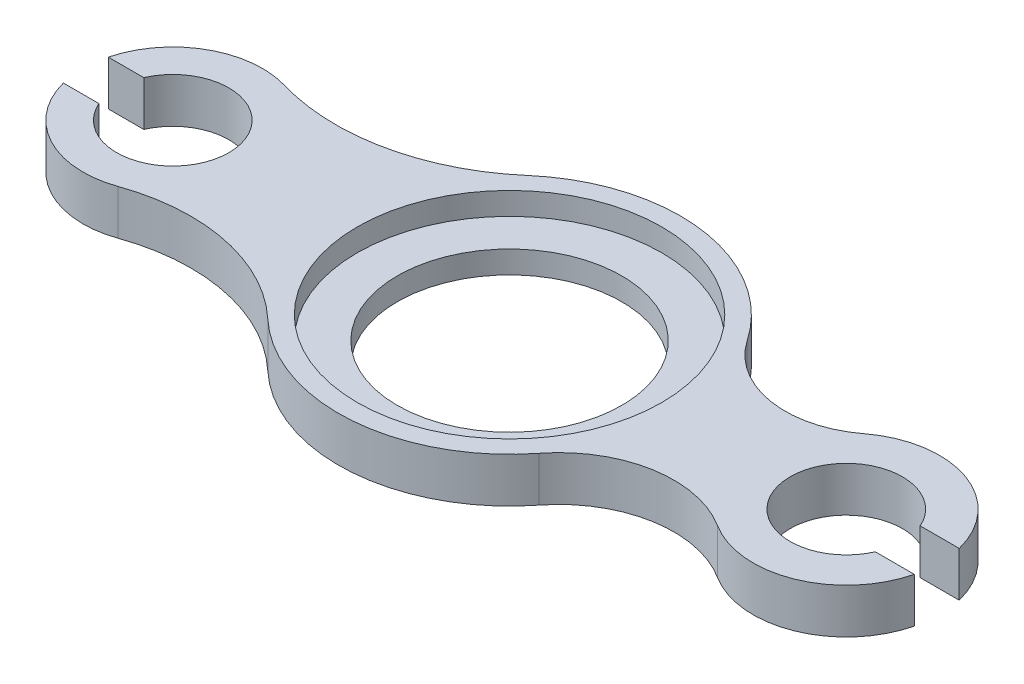
ISO-10303-21;
HEADER;
FILE_DESCRIPTION(('STEP AP214'),'2;1');
FILE_NAME('part.step','',(''),(''),'','','');
FILE_SCHEMA(('AUTOMOTIVE_DESIGN { 1 0 10303 214 1 1 1 1 }'));
ENDSEC;
DATA;
#1=APPLICATION_CONTEXT('core data for automotive mechanical design processes');
#2=APPLICATION_PROTOCOL_DEFINITION('international standard','automotive_design',2000,#1);
#3=PRODUCT_CONTEXT('',#1,'mechanical');
#4=PRODUCT('Part','Part','',(#3));
#5=PRODUCT_RELATED_PRODUCT_CATEGORY('part','',(#4));
#6=PRODUCT_DEFINITION_FORMATION('','',#4);
#7=PRODUCT_DEFINITION_CONTEXT('part definition',#1,'design');
#8=PRODUCT_DEFINITION('design','',#6,#7);
#9=PRODUCT_DEFINITION_SHAPE('','',#8);
#10=(LENGTH_UNIT() NAMED_UNIT(*) SI_UNIT(.MILLI.,.METRE.));
#11=(NAMED_UNIT(*) PLANE_ANGLE_UNIT() SI_UNIT($,.RADIAN.));
#12=(NAMED_UNIT(*) SI_UNIT($,.STERADIAN.) SOLID_ANGLE_UNIT());
#13=UNCERTAINTY_MEASURE_WITH_UNIT(LENGTH_MEASURE(1.E-05),#10,'distance_accuracy_value','');
#14=(GEOMETRIC_REPRESENTATION_CONTEXT(3) GLOBAL_UNCERTAINTY_ASSIGNED_CONTEXT((#13)) GLOBAL_UNIT_ASSIGNED_CONTEXT((#10,
#11,#12)) REPRESENTATION_CONTEXT('',''));
#15=CARTESIAN_POINT('',(0.,0.,0.));
#16=DIRECTION('',(0.,0.,1.));
#17=DIRECTION('',(1.,0.,0.));
#18=AXIS2_PLACEMENT_3D('',#15,#16,#17);
#19=CARTESIAN_POINT('',(0.,20.,-10.));
#20=DIRECTION('',(0.,0.,-1.));
#21=DIRECTION('',(-1.,0.,0.));
#22=AXIS2_PLACEMENT_3D('',#19,#20,#21);
#23=PLANE('',#22);
#24=DIRECTION('',(1.,0.,0.));
#25=VECTOR('',#24,1.);
#26=CARTESIAN_POINT('',(0.,0.,-10.));
#27=LINE('',#26,#25);
#28=CARTESIAN_POINT('',(242.754590009258,0.,-10.));
#29=VERTEX_POINT('',#28);
#30=CARTESIAN_POINT('',(260.147485469304,0.,-10.));
#31=VERTEX_POINT('',#30);
#32=EDGE_CURVE('E192',#29,#31,#27,.T.);
#33=ORIENTED_EDGE('',*,*,#32,.T.);
#34=DIRECTION('',(0.,-1.,0.));
#35=VECTOR('',#34,1.);
#36=CARTESIAN_POINT('',(260.147485469304,20.,-10.));
#37=LINE('',#36,#35);
#38=CARTESIAN_POINT('',(260.147485469304,20.,-10.));
#39=VERTEX_POINT('',#38);
#40=EDGE_CURVE('E51',#39,#31,#37,.T.);
#41=ORIENTED_EDGE('',*,*,#40,.F.);
#42=DIRECTION('',(1.,0.,0.));
#43=VECTOR('',#42,1.);
#44=CARTESIAN_POINT('',(0.,20.,-10.));
#45=LINE('',#44,#43);
#46=CARTESIAN_POINT('',(242.754590009258,20.,-10.));
#47=VERTEX_POINT('',#46);
#48=EDGE_CURVE('E414',#47,#39,#45,.T.);
#49=ORIENTED_EDGE('',*,*,#48,.F.);
#50=DIRECTION('',(0.,-1.,0.));
#51=VECTOR('',#50,1.);
#52=CARTESIAN_POINT('',(242.754590009258,20.,-10.));
#53=LINE('',#52,#51);
#54=EDGE_CURVE('E59',#47,#29,#53,.T.);
#55=ORIENTED_EDGE('',*,*,#54,.T.);
#56=EDGE_LOOP('',(#33,#41,#49,#55));
#57=FACE_BOUND('',#56,.T.);
#58=ADVANCED_FACE('F41',(#57),#23,.F.);
#59=CARTESIAN_POINT('',(219.841711534479,20.,0.));
#60=DIRECTION('',(0.,-1.,0.));
#61=DIRECTION('',(0.,0.,-1.));
#62=AXIS2_PLACEMENT_3D('',#59,#60,#61);
#63=CYLINDRICAL_SURFACE('',#62,41.5277667649636);
#64=CARTESIAN_POINT('',(219.841711534479,0.,0.));
#65=DIRECTION('',(0.,1.,0.));
#66=DIRECTION('',(0.,0.,1.));
#67=AXIS2_PLACEMENT_3D('',#64,#65,#66);
#68=CIRCLE('',#67,41.5277667649636);
#69=CARTESIAN_POINT('',(194.644031061955,0.,-33.0095790838023));
#70=VERTEX_POINT('',#69);
#71=EDGE_CURVE('E195',#31,#70,#68,.T.);
#72=ORIENTED_EDGE('',*,*,#71,.T.);
#73=DIRECTION('',(0.,-1.,0.));
#74=VECTOR('',#73,1.);
#75=CARTESIAN_POINT('',(194.644031061955,20.,-33.0095790838023));
#76=LINE('',#75,#74);
#77=CARTESIAN_POINT('',(194.644031061955,20.,-33.0095790838023));
#78=VERTEX_POINT('',#77);
#79=EDGE_CURVE('E290',#78,#70,#76,.T.);
#80=ORIENTED_EDGE('',*,*,#79,.F.);
#81=CARTESIAN_POINT('',(219.841711534479,20.,0.));
#82=DIRECTION('',(0.,1.,0.));
#83=DIRECTION('',(0.,0.,1.));
#84=AXIS2_PLACEMENT_3D('',#81,#82,#83);
#85=CIRCLE('',#84,41.5277667649636);
#86=EDGE_CURVE('E122',#39,#78,#85,.T.);
#87=ORIENTED_EDGE('',*,*,#86,.F.);
#88=ORIENTED_EDGE('',*,*,#40,.T.);
#89=EDGE_LOOP('',(#72,#80,#87,#88));
#90=FACE_BOUND('',#89,.T.);
#91=ADVANCED_FACE('F294',(#90),#63,.T.);
#92=CARTESIAN_POINT('',(168.418508371809,20.,-67.3656566679429));
#93=DIRECTION('',(0.,-1.,0.));
#94=DIRECTION('',(0.,0.,-1.));
#95=AXIS2_PLACEMENT_3D('',#92,#93,#94);
#96=CYLINDRICAL_SURFACE('',#95,43.2217318873138);
#97=CARTESIAN_POINT('',(168.418508371809,0.,-67.3656566679429));
#98=DIRECTION('',(0.,1.,0.));
#99=DIRECTION('',(0.,0.,1.));
#100=AXIS2_PLACEMENT_3D('',#97,#98,#99);
#101=CIRCLE('',#100,43.2217318873138);
#102=CARTESIAN_POINT('',(132.733534148836,0.,-42.9791702042355));
#103=VERTEX_POINT('',#102);
#104=EDGE_CURVE('E200',#103,#70,#101,.T.);
#105=ORIENTED_EDGE('',*,*,#104,.F.);
#106=DIRECTION('',(0.,-1.,0.));
#107=VECTOR('',#106,1.);
#108=CARTESIAN_POINT('',(132.733534148836,20.,-42.9791702042355));
#109=LINE('',#108,#107);
#110=CARTESIAN_POINT('',(132.733534148836,20.,-42.9791702042355));
#111=VERTEX_POINT('',#110);
#112=EDGE_CURVE('E287',#111,#103,#109,.T.);
#113=ORIENTED_EDGE('',*,*,#112,.F.);
#114=CARTESIAN_POINT('',(168.418508371809,20.,-67.3656566679429));
#115=DIRECTION('',(0.,1.,0.));
#116=DIRECTION('',(0.,0.,1.));
#117=AXIS2_PLACEMENT_3D('',#114,#115,#116);
#118=CIRCLE('',#117,43.2217318873138);
#119=EDGE_CURVE('E424',#111,#78,#118,.T.);
#120=ORIENTED_EDGE('',*,*,#119,.T.);
#121=ORIENTED_EDGE('',*,*,#79,.T.);
#122=EDGE_LOOP('',(#105,#113,#120,#121));
#123=FACE_BOUND('',#122,.T.);
#124=ADVANCED_FACE('F314',(#123),#96,.F.);
#125=CARTESIAN_POINT('',(69.8417115344792,20.,0.));
#126=DIRECTION('',(0.,-1.,0.));
#127=DIRECTION('',(0.,0.,-1.));
#128=AXIS2_PLACEMENT_3D('',#125,#126,#127);
#129=CYLINDRICAL_SURFACE('',#128,76.1747361216329);
#130=CARTESIAN_POINT('',(69.8417115344792,0.,0.));
#131=DIRECTION('',(0.,1.,0.));
#132=DIRECTION('',(0.,0.,1.));
#133=AXIS2_PLACEMENT_3D('',#130,#131,#132);
#134=CIRCLE('',#133,76.1747361216329);
#135=CARTESIAN_POINT('',(20.1305181494598,0.,-57.7181745677877));
#136=VERTEX_POINT('',#135);
#137=EDGE_CURVE('E204',#103,#136,#134,.T.);
#138=ORIENTED_EDGE('',*,*,#137,.T.);
#139=DIRECTION('',(0.,-1.,0.));
#140=VECTOR('',#139,1.);
#141=CARTESIAN_POINT('',(20.1305181494598,20.,-57.7181745677877));
#142=LINE('',#141,#140);
#143=CARTESIAN_POINT('',(20.1305181494598,20.,-57.7181745677877));
#144=VERTEX_POINT('',#143);
#145=EDGE_CURVE('E284',#144,#136,#142,.T.);
#146=ORIENTED_EDGE('',*,*,#145,.F.);
#147=CARTESIAN_POINT('',(69.8417115344792,20.,0.));
#148=DIRECTION('',(0.,1.,0.));
#149=DIRECTION('',(0.,0.,1.));
#150=AXIS2_PLACEMENT_3D('',#147,#148,#149);
#151=CIRCLE('',#150,76.1747361216329);
#152=EDGE_CURVE('E428',#111,#144,#151,.T.);
#153=ORIENTED_EDGE('',*,*,#152,.F.);
#154=ORIENTED_EDGE('',*,*,#112,.T.);
#155=EDGE_LOOP('',(#138,#146,#153,#154));
#156=FACE_BOUND('',#155,.T.);
#157=ADVANCED_FACE('F319',(#156),#129,.T.);
#158=CARTESIAN_POINT('',(-42.201654217441,20.,-130.09018901527));
#159=DIRECTION('',(0.,-1.,0.));
#160=DIRECTION('',(0.,0.,-1.));
#161=AXIS2_PLACEMENT_3D('',#158,#159,#160);
#162=CYLINDRICAL_SURFACE('',#161,95.5144396788446);
#163=CARTESIAN_POINT('',(-42.201654217441,0.,-130.09018901527));
#164=DIRECTION('',(0.,1.,0.));
#165=DIRECTION('',(0.,0.,1.));
#166=AXIS2_PLACEMENT_3D('',#163,#164,#165);
#167=CIRCLE('',#166,95.5144396788446);
#168=CARTESIAN_POINT('',(-68.9545719204698,0.,-38.398915812535));
#169=VERTEX_POINT('',#168);
#170=EDGE_CURVE('E208',#169,#136,#167,.T.);
#171=ORIENTED_EDGE('',*,*,#170,.F.);
#172=DIRECTION('',(0.,-1.,0.));
#173=VECTOR('',#172,1.);
#174=CARTESIAN_POINT('',(-68.9545719204698,20.,-38.398915812535));
#175=LINE('',#174,#173);
#176=CARTESIAN_POINT('',(-68.9545719204698,20.,-38.398915812535));
#177=VERTEX_POINT('',#176);
#178=EDGE_CURVE('E281',#177,#169,#175,.T.);
#179=ORIENTED_EDGE('',*,*,#178,.F.);
#180=CARTESIAN_POINT('',(-42.201654217441,20.,-130.09018901527));
#181=DIRECTION('',(0.,1.,0.));
#182=DIRECTION('',(0.,0.,1.));
#183=AXIS2_PLACEMENT_3D('',#180,#181,#182);
#184=CIRCLE('',#183,95.5144396788446);
#185=EDGE_CURVE('E431',#177,#144,#184,.T.);
#186=ORIENTED_EDGE('',*,*,#185,.T.);
#187=ORIENTED_EDGE('',*,*,#145,.T.);
#188=EDGE_LOOP('',(#171,#179,#186,#187));
#189=FACE_BOUND('',#188,.T.);
#190=ADVANCED_FACE('F323',(#189),#162,.F.);
#191=CARTESIAN_POINT('',(-80.1582884655208,20.,0.));
#192=DIRECTION('',(0.,-1.,0.));
#193=DIRECTION('',(0.,0.,-1.));
#194=AXIS2_PLACEMENT_3D('',#191,#192,#193);
#195=CYLINDRICAL_SURFACE('',#194,40.);
#196=CARTESIAN_POINT('',(-80.1582884655208,0.,0.));
#197=DIRECTION('',(0.,1.,0.));
#198=DIRECTION('',(0.,0.,1.));
#199=AXIS2_PLACEMENT_3D('',#196,#197,#198);
#200=CIRCLE('',#199,40.);
#201=CARTESIAN_POINT('',(-118.888121927595,0.,-10.));
#202=VERTEX_POINT('',#201);
#203=EDGE_CURVE('E212',#169,#202,#200,.T.);
#204=ORIENTED_EDGE('',*,*,#203,.T.);
#205=DIRECTION('',(0.,-1.,0.));
#206=VECTOR('',#205,1.);
#207=CARTESIAN_POINT('',(-118.888121927595,20.,-10.));
#208=LINE('',#207,#206);
#209=CARTESIAN_POINT('',(-118.888121927595,20.,-10.));
#210=VERTEX_POINT('',#209);
#211=EDGE_CURVE('E277',#210,#202,#208,.T.);
#212=ORIENTED_EDGE('',*,*,#211,.F.);
#213=CARTESIAN_POINT('',(-80.1582884655208,20.,0.));
#214=DIRECTION('',(0.,1.,0.));
#215=DIRECTION('',(0.,0.,1.));
#216=AXIS2_PLACEMENT_3D('',#213,#214,#215);
#217=CIRCLE('',#216,40.);
#218=EDGE_CURVE('E435',#177,#210,#217,.T.);
#219=ORIENTED_EDGE('',*,*,#218,.F.);
#220=ORIENTED_EDGE('',*,*,#178,.T.);
#221=EDGE_LOOP('',(#204,#212,#219,#220));
#222=FACE_BOUND('',#221,.T.);
#223=ADVANCED_FACE('F327',(#222),#195,.T.);
#224=CARTESIAN_POINT('',(0.,20.,-10.));
#225=DIRECTION('',(0.,0.,-1.));
#226=DIRECTION('',(-1.,0.,0.));
#227=AXIS2_PLACEMENT_3D('',#224,#225,#226);
#228=PLANE('',#227);
#229=DIRECTION('',(1.,0.,0.));
#230=VECTOR('',#229,1.);
#231=CARTESIAN_POINT('',(0.,0.,-10.));
#232=LINE('',#231,#230);
#233=CARTESIAN_POINT('',(-103.0711669403,0.,-10.));
#234=VERTEX_POINT('',#233);
#235=EDGE_CURVE('E215',#202,#234,#232,.T.);
#236=ORIENTED_EDGE('',*,*,#235,.T.);
#237=DIRECTION('',(0.,-1.,0.));
#238=VECTOR('',#237,1.);
#239=CARTESIAN_POINT('',(-103.0711669403,20.,-10.));
#240=LINE('',#239,#238);
#241=CARTESIAN_POINT('',(-103.0711669403,20.,-10.));
#242=VERTEX_POINT('',#241);
#243=EDGE_CURVE('E274',#242,#234,#240,.T.);
#244=ORIENTED_EDGE('',*,*,#243,.F.);
#245=DIRECTION('',(1.,0.,0.));
#246=VECTOR('',#245,1.);
#247=CARTESIAN_POINT('',(0.,20.,-10.));
#248=LINE('',#247,#246);
#249=EDGE_CURVE('E438',#210,#242,#248,.T.);
#250=ORIENTED_EDGE('',*,*,#249,.F.);
#251=ORIENTED_EDGE('',*,*,#211,.T.);
#252=EDGE_LOOP('',(#236,#244,#250,#251));
#253=FACE_BOUND('',#252,.T.);
#254=ADVANCED_FACE('F331',(#253),#228,.F.);
#255=CARTESIAN_POINT('',(-80.1582884655208,20.,0.));
#256=DIRECTION('',(0.,-1.,0.));
#257=DIRECTION('',(0.,0.,-1.));
#258=AXIS2_PLACEMENT_3D('',#255,#256,#257);
#259=CYLINDRICAL_SURFACE('',#258,25.);
#260=CARTESIAN_POINT('',(-80.1582884655208,0.,0.));
#261=DIRECTION('',(0.,1.,0.));
#262=DIRECTION('',(0.,0.,1.));
#263=AXIS2_PLACEMENT_3D('',#260,#261,#262);
#264=CIRCLE('',#263,25.);
#265=CARTESIAN_POINT('',(-103.0711669403,0.,10.));
#266=VERTEX_POINT('',#265);
#267=EDGE_CURVE('E219',#266,#234,#264,.T.);
#268=ORIENTED_EDGE('',*,*,#267,.F.);
#269=DIRECTION('',(0.,-1.,0.));
#270=VECTOR('',#269,1.);
#271=CARTESIAN_POINT('',(-103.0711669403,20.,10.));
#272=LINE('',#271,#270);
#273=CARTESIAN_POINT('',(-103.0711669403,20.,10.));
#274=VERTEX_POINT('',#273);
#275=EDGE_CURVE('E271',#274,#266,#272,.T.);
#276=ORIENTED_EDGE('',*,*,#275,.F.);
#277=CARTESIAN_POINT('',(-80.1582884655208,20.,0.));
#278=DIRECTION('',(0.,1.,0.));
#279=DIRECTION('',(0.,0.,1.));
#280=AXIS2_PLACEMENT_3D('',#277,#278,#279);
#281=CIRCLE('',#280,25.);
#282=EDGE_CURVE('E441',#274,#242,#281,.T.);
#283=ORIENTED_EDGE('',*,*,#282,.T.);
#284=ORIENTED_EDGE('',*,*,#243,.T.);
#285=EDGE_LOOP('',(#268,#276,#283,#284));
#286=FACE_BOUND('',#285,.T.);
#287=ADVANCED_FACE('F335',(#286),#259,.F.);
#288=CARTESIAN_POINT('',(0.,20.,9.99999999999999));
#289=DIRECTION('',(0.,0.,-1.));
#290=DIRECTION('',(-1.,0.,0.));
#291=AXIS2_PLACEMENT_3D('',#288,#289,#290);
#292=PLANE('',#291);
#293=DIRECTION('',(1.,0.,0.));
#294=VECTOR('',#293,1.);
#295=CARTESIAN_POINT('',(0.,0.,9.99999999999999));
#296=LINE('',#295,#294);
#297=CARTESIAN_POINT('',(-118.888121927595,0.,10.));
#298=VERTEX_POINT('',#297);
#299=EDGE_CURVE('E223',#298,#266,#296,.T.);
#300=ORIENTED_EDGE('',*,*,#299,.F.);
#301=DIRECTION('',(0.,-1.,0.));
#302=VECTOR('',#301,1.);
#303=CARTESIAN_POINT('',(-118.888121927595,20.,10.));
#304=LINE('',#303,#302);
#305=CARTESIAN_POINT('',(-118.888121927595,20.,10.));
#306=VERTEX_POINT('',#305);
#307=EDGE_CURVE('E268',#306,#298,#304,.T.);
#308=ORIENTED_EDGE('',*,*,#307,.F.);
#309=DIRECTION('',(1.,0.,0.));
#310=VECTOR('',#309,1.);
#311=CARTESIAN_POINT('',(0.,20.,9.99999999999999));
#312=LINE('',#311,#310);
#313=EDGE_CURVE('E445',#306,#274,#312,.T.);
#314=ORIENTED_EDGE('',*,*,#313,.T.);
#315=ORIENTED_EDGE('',*,*,#275,.T.);
#316=EDGE_LOOP('',(#300,#308,#314,#315));
#317=FACE_BOUND('',#316,.T.);
#318=ADVANCED_FACE('F339',(#317),#292,.T.);
#319=CARTESIAN_POINT('',(-80.1582884655208,20.,0.));
#320=DIRECTION('',(0.,-1.,0.));
#321=DIRECTION('',(0.,0.,-1.));
#322=AXIS2_PLACEMENT_3D('',#319,#320,#321);
#323=CYLINDRICAL_SURFACE('',#322,40.);
#324=CARTESIAN_POINT('',(-80.1582884655208,0.,0.));
#325=DIRECTION('',(0.,1.,0.));
#326=DIRECTION('',(0.,0.,1.));
#327=AXIS2_PLACEMENT_3D('',#324,#325,#326);
#328=CIRCLE('',#327,40.);
#329=CARTESIAN_POINT('',(-66.8101901409746,0.,37.7071381984665));
#330=VERTEX_POINT('',#329);
#331=EDGE_CURVE('E227',#298,#330,#328,.T.);
#332=ORIENTED_EDGE('',*,*,#331,.T.);
#333=DIRECTION('',(0.,-1.,0.));
#334=VECTOR('',#333,1.);
#335=CARTESIAN_POINT('',(-66.8101901409746,20.,37.7071381984665));
#336=LINE('',#335,#334);
#337=CARTESIAN_POINT('',(-66.8101901409746,20.,37.7071381984665));
#338=VERTEX_POINT('',#337);
#339=EDGE_CURVE('E265',#338,#330,#336,.T.);
#340=ORIENTED_EDGE('',*,*,#339,.F.);
#341=CARTESIAN_POINT('',(-80.1582884655208,20.,0.));
#342=DIRECTION('',(0.,1.,0.));
#343=DIRECTION('',(0.,0.,1.));
#344=AXIS2_PLACEMENT_3D('',#341,#342,#343);
#345=CIRCLE('',#344,40.);
#346=EDGE_CURVE('E449',#306,#338,#345,.T.);
#347=ORIENTED_EDGE('',*,*,#346,.F.);
#348=ORIENTED_EDGE('',*,*,#307,.T.);
#349=EDGE_LOOP('',(#332,#340,#347,#348));
#350=FACE_BOUND('',#349,.T.);
#351=ADVANCED_FACE('F343',(#350),#323,.T.);
#352=CARTESIAN_POINT('',(-39.1539406489895,20.,115.833474721464));
#353=DIRECTION('',(0.,-1.,0.));
#354=DIRECTION('',(0.,0.,-1.));
#355=AXIS2_PLACEMENT_3D('',#352,#353,#354);
#356=CYLINDRICAL_SURFACE('',#355,82.8769726429941);
#357=CARTESIAN_POINT('',(-39.1539406489895,0.,115.833474721464));
#358=DIRECTION('',(0.,1.,0.));
#359=DIRECTION('',(0.,0.,1.));
#360=AXIS2_PLACEMENT_3D('',#357,#358,#359);
#361=CIRCLE('',#360,82.8769726429941);
#362=CARTESIAN_POINT('',(17.6403544540105,0.,55.4761997811477));
#363=VERTEX_POINT('',#362);
#364=EDGE_CURVE('E231',#363,#330,#361,.T.);
#365=ORIENTED_EDGE('',*,*,#364,.F.);
#366=DIRECTION('',(0.,-1.,0.));
#367=VECTOR('',#366,1.);
#368=CARTESIAN_POINT('',(17.6403544540105,20.,55.4761997811477));
#369=LINE('',#368,#367);
#370=CARTESIAN_POINT('',(17.6403544540105,20.,55.4761997811477));
#371=VERTEX_POINT('',#370);
#372=EDGE_CURVE('E262',#371,#363,#369,.T.);
#373=ORIENTED_EDGE('',*,*,#372,.F.);
#374=CARTESIAN_POINT('',(-39.1539406489895,20.,115.833474721464));
#375=DIRECTION('',(0.,1.,0.));
#376=DIRECTION('',(0.,0.,1.));
#377=AXIS2_PLACEMENT_3D('',#374,#375,#376);
#378=CIRCLE('',#377,82.8769726429941);
#379=EDGE_CURVE('E452',#371,#338,#378,.T.);
#380=ORIENTED_EDGE('',*,*,#379,.T.);
#381=ORIENTED_EDGE('',*,*,#339,.T.);
#382=EDGE_LOOP('',(#365,#373,#380,#381));
#383=FACE_BOUND('',#382,.T.);
#384=ADVANCED_FACE('F347',(#383),#356,.F.);
#385=CARTESIAN_POINT('',(69.8417115344792,20.,0.));
#386=DIRECTION('',(0.,-1.,0.));
#387=DIRECTION('',(0.,0.,-1.));
#388=AXIS2_PLACEMENT_3D('',#385,#386,#387);
#389=CYLINDRICAL_SURFACE('',#388,76.1747361216329);
#390=CARTESIAN_POINT('',(69.8417115344792,0.,0.));
#391=DIRECTION('',(0.,1.,0.));
#392=DIRECTION('',(0.,0.,1.));
#393=AXIS2_PLACEMENT_3D('',#390,#391,#392);
#394=CIRCLE('',#393,76.1747361216329);
#395=CARTESIAN_POINT('',(129.887825017134,0.,46.8727498534977));
#396=VERTEX_POINT('',#395);
#397=EDGE_CURVE('E235',#363,#396,#394,.T.);
#398=ORIENTED_EDGE('',*,*,#397,.T.);
#399=DIRECTION('',(0.,-1.,0.));
#400=VECTOR('',#399,1.);
#401=CARTESIAN_POINT('',(129.887825017134,20.,46.8727498534977));
#402=LINE('',#401,#400);
#403=CARTESIAN_POINT('',(129.887825017134,20.,46.8727498534977));
#404=VERTEX_POINT('',#403);
#405=EDGE_CURVE('E259',#404,#396,#402,.T.);
#406=ORIENTED_EDGE('',*,*,#405,.F.);
#407=CARTESIAN_POINT('',(69.8417115344792,20.,0.));
#408=DIRECTION('',(0.,1.,0.));
#409=DIRECTION('',(0.,0.,1.));
#410=AXIS2_PLACEMENT_3D('',#407,#408,#409);
#411=CIRCLE('',#410,76.1747361216329);
#412=EDGE_CURVE('E456',#371,#404,#411,.T.);
#413=ORIENTED_EDGE('',*,*,#412,.F.);
#414=ORIENTED_EDGE('',*,*,#372,.T.);
#415=EDGE_LOOP('',(#398,#406,#413,#414));
#416=FACE_BOUND('',#415,.T.);
#417=ADVANCED_FACE('F351',(#416),#389,.T.);
#418=CARTESIAN_POINT('',(170.267202677188,20.,78.3933988767921));
#419=DIRECTION('',(0.,-1.,0.));
#420=DIRECTION('',(0.,0.,-1.));
#421=AXIS2_PLACEMENT_3D('',#418,#419,#420);
#422=CYLINDRICAL_SURFACE('',#421,51.2254375780532);
#423=CARTESIAN_POINT('',(170.267202677188,0.,78.3933988767921));
#424=DIRECTION('',(0.,1.,0.));
#425=DIRECTION('',(0.,0.,1.));
#426=AXIS2_PLACEMENT_3D('',#423,#424,#425);
#427=CIRCLE('',#426,51.2254375780532);
#428=CARTESIAN_POINT('',(197.646050954391,0.,35.0985478887478));
#429=VERTEX_POINT('',#428);
#430=EDGE_CURVE('E239',#429,#396,#427,.T.);
#431=ORIENTED_EDGE('',*,*,#430,.F.);
#432=DIRECTION('',(0.,-1.,0.));
#433=VECTOR('',#432,1.);
#434=CARTESIAN_POINT('',(197.646050954391,20.,35.0985478887478));
#435=LINE('',#434,#433);
#436=CARTESIAN_POINT('',(197.646050954391,20.,35.0985478887478));
#437=VERTEX_POINT('',#436);
#438=EDGE_CURVE('E182',#437,#429,#435,.T.);
#439=ORIENTED_EDGE('',*,*,#438,.F.);
#440=CARTESIAN_POINT('',(170.267202677188,20.,78.3933988767921));
#441=DIRECTION('',(0.,1.,0.));
#442=DIRECTION('',(0.,0.,1.));
#443=AXIS2_PLACEMENT_3D('',#440,#441,#442);
#444=CIRCLE('',#443,51.2254375780532);
#445=EDGE_CURVE('E170',#437,#404,#444,.T.);
#446=ORIENTED_EDGE('',*,*,#445,.T.);
#447=ORIENTED_EDGE('',*,*,#405,.T.);
#448=EDGE_LOOP('',(#431,#439,#446,#447));
#449=FACE_BOUND('',#448,.T.);
#450=ADVANCED_FACE('F355',(#449),#422,.F.);
#451=CARTESIAN_POINT('',(219.841711534479,20.,0.));
#452=DIRECTION('',(0.,-1.,0.));
#453=DIRECTION('',(0.,0.,-1.));
#454=AXIS2_PLACEMENT_3D('',#451,#452,#453);
#455=CYLINDRICAL_SURFACE('',#454,41.5277667649636);
#456=CARTESIAN_POINT('',(219.841711534479,0.,0.));
#457=DIRECTION('',(0.,1.,0.));
#458=DIRECTION('',(0.,0.,1.));
#459=AXIS2_PLACEMENT_3D('',#456,#457,#458);
#460=CIRCLE('',#459,41.5277667649636);
#461=CARTESIAN_POINT('',(260.147485469304,0.,10.));
#462=VERTEX_POINT('',#461);
#463=EDGE_CURVE('E178',#429,#462,#460,.T.);
#464=ORIENTED_EDGE('',*,*,#463,.T.);
#465=DIRECTION('',(0.,-1.,0.));
#466=VECTOR('',#465,1.);
#467=CARTESIAN_POINT('',(260.147485469304,20.,10.));
#468=LINE('',#467,#466);
#469=CARTESIAN_POINT('',(260.147485469304,20.,10.));
#470=VERTEX_POINT('',#469);
#471=EDGE_CURVE('E175',#470,#462,#468,.T.);
#472=ORIENTED_EDGE('',*,*,#471,.F.);
#473=CARTESIAN_POINT('',(219.841711534479,20.,0.));
#474=DIRECTION('',(0.,1.,0.));
#475=DIRECTION('',(0.,0.,1.));
#476=AXIS2_PLACEMENT_3D('',#473,#474,#475);
#477=CIRCLE('',#476,41.5277667649636);
#478=EDGE_CURVE('E163',#437,#470,#477,.T.);
#479=ORIENTED_EDGE('',*,*,#478,.F.);
#480=ORIENTED_EDGE('',*,*,#438,.T.);
#481=EDGE_LOOP('',(#464,#472,#479,#480));
#482=FACE_BOUND('',#481,.T.);
#483=ADVANCED_FACE('F176',(#482),#455,.T.);
#484=CARTESIAN_POINT('',(0.,20.,10.));
#485=DIRECTION('',(0.,0.,-1.));
#486=DIRECTION('',(-1.,0.,0.));
#487=AXIS2_PLACEMENT_3D('',#484,#485,#486);
#488=PLANE('',#487);
#489=DIRECTION('',(1.,0.,0.));
#490=VECTOR('',#489,1.);
#491=CARTESIAN_POINT('',(0.,0.,10.));
#492=LINE('',#491,#490);
#493=CARTESIAN_POINT('',(242.754590009258,0.,10.));
#494=VERTEX_POINT('',#493);
#495=EDGE_CURVE('E245',#494,#462,#492,.T.);
#496=ORIENTED_EDGE('',*,*,#495,.F.);
#497=DIRECTION('',(0.,-1.,0.));
#498=VECTOR('',#497,1.);
#499=CARTESIAN_POINT('',(242.754590009258,20.,10.));
#500=LINE('',#499,#498);
#501=CARTESIAN_POINT('',(242.754590009258,20.,10.));
#502=VERTEX_POINT('',#501);
#503=EDGE_CURVE('E109',#502,#494,#500,.T.);
#504=ORIENTED_EDGE('',*,*,#503,.F.);
#505=DIRECTION('',(1.,0.,0.));
#506=VECTOR('',#505,1.);
#507=CARTESIAN_POINT('',(0.,20.,10.));
#508=LINE('',#507,#506);
#509=EDGE_CURVE('E168',#502,#470,#508,.T.);
#510=ORIENTED_EDGE('',*,*,#509,.T.);
#511=ORIENTED_EDGE('',*,*,#471,.T.);
#512=EDGE_LOOP('',(#496,#504,#510,#511));
#513=FACE_BOUND('',#512,.T.);
#514=ADVANCED_FACE('F184',(#513),#488,.T.);
#515=CARTESIAN_POINT('',(69.8417115344792,20.,0.));
#516=DIRECTION('',(0.,-1.,0.));
#517=DIRECTION('',(0.,0.,-1.));
#518=AXIS2_PLACEMENT_3D('',#515,#516,#517);
#519=CYLINDRICAL_SURFACE('',#518,67.8);
#520=CARTESIAN_POINT('',(69.8417115344792,10.,0.));
#521=DIRECTION('',(0.,1.,0.));
#522=DIRECTION('',(0.,0.,1.));
#523=AXIS2_PLACEMENT_3D('',#520,#521,#522);
#524=CIRCLE('',#523,67.8);
#525=CARTESIAN_POINT('',(69.8417115344792,10.,67.8));
#526=VERTEX_POINT('',#525);
#527=EDGE_CURVE('E11',#526,#526,#524,.T.);
#528=ORIENTED_EDGE('',*,*,#527,.F.);
#529=EDGE_LOOP('',(#528));
#530=FACE_BOUND('',#529,.T.);
#531=CARTESIAN_POINT('',(69.8417115344792,20.,0.));
#532=DIRECTION('',(0.,1.,0.));
#533=DIRECTION('',(0.,0.,1.));
#534=AXIS2_PLACEMENT_3D('',#531,#532,#533);
#535=CIRCLE('',#534,67.8);
#536=CARTESIAN_POINT('',(69.8417115344792,20.,67.8));
#537=VERTEX_POINT('',#536);
#538=EDGE_CURVE('E252',#537,#537,#535,.T.);
#539=ORIENTED_EDGE('',*,*,#538,.T.);
#540=EDGE_LOOP('',(#539));
#541=FACE_BOUND('',#540,.T.);
#542=ADVANCED_FACE('F43',(#530,#541),#519,.F.);
#543=CARTESIAN_POINT('',(219.841711534479,20.,0.));
#544=DIRECTION('',(0.,-1.,0.));
#545=DIRECTION('',(0.,0.,-1.));
#546=AXIS2_PLACEMENT_3D('',#543,#544,#545);
#547=CYLINDRICAL_SURFACE('',#546,25.);
#548=CARTESIAN_POINT('',(219.841711534479,0.,0.));
#549=DIRECTION('',(0.,1.,0.));
#550=DIRECTION('',(0.,0.,1.));
#551=AXIS2_PLACEMENT_3D('',#548,#549,#550);
#552=CIRCLE('',#551,25.);
#553=EDGE_CURVE('E248',#29,#494,#552,.T.);
#554=ORIENTED_EDGE('',*,*,#553,.F.);
#555=ORIENTED_EDGE('',*,*,#54,.F.);
#556=CARTESIAN_POINT('',(219.841711534479,20.,0.));
#557=DIRECTION('',(0.,1.,0.));
#558=DIRECTION('',(0.,0.,1.));
#559=AXIS2_PLACEMENT_3D('',#556,#557,#558);
#560=CIRCLE('',#559,25.);
#561=EDGE_CURVE('E186',#47,#502,#560,.T.);
#562=ORIENTED_EDGE('',*,*,#561,.T.);
#563=ORIENTED_EDGE('',*,*,#503,.T.);
#564=EDGE_LOOP('',(#554,#555,#562,#563));
#565=FACE_BOUND('',#564,.T.);
#566=ADVANCED_FACE('F298',(#565),#547,.F.);
#567=CARTESIAN_POINT('',(0.,20.,0.));
#568=DIRECTION('',(0.,1.,0.));
#569=DIRECTION('',(0.,0.,1.));
#570=AXIS2_PLACEMENT_3D('',#567,#568,#569);
#571=PLANE('',#570);
#572=ORIENTED_EDGE('',*,*,#538,.F.);
#573=EDGE_LOOP('',(#572));
#574=FACE_BOUND('',#573,.T.);
#575=ORIENTED_EDGE('',*,*,#48,.T.);
#576=ORIENTED_EDGE('',*,*,#86,.T.);
#577=ORIENTED_EDGE('',*,*,#119,.F.);
#578=ORIENTED_EDGE('',*,*,#152,.T.);
#579=ORIENTED_EDGE('',*,*,#185,.F.);
#580=ORIENTED_EDGE('',*,*,#218,.T.);
#581=ORIENTED_EDGE('',*,*,#249,.T.);
#582=ORIENTED_EDGE('',*,*,#282,.F.);
#583=ORIENTED_EDGE('',*,*,#313,.F.);
#584=ORIENTED_EDGE('',*,*,#346,.T.);
#585=ORIENTED_EDGE('',*,*,#379,.F.);
#586=ORIENTED_EDGE('',*,*,#412,.T.);
#587=ORIENTED_EDGE('',*,*,#445,.F.);
#588=ORIENTED_EDGE('',*,*,#478,.T.);
#589=ORIENTED_EDGE('',*,*,#509,.F.);
#590=ORIENTED_EDGE('',*,*,#561,.F.);
#591=EDGE_LOOP('',(#575,#576,#577,#578,#579,#580,#581,#582,#583,#584,#585,#586,#587,#588,#589,#590));
#592=FACE_BOUND('',#591,.T.);
#593=ADVANCED_FACE('F165',(#574,#592),#571,.T.);
#594=CARTESIAN_POINT('',(0.,0.,0.));
#595=DIRECTION('',(0.,1.,0.));
#596=DIRECTION('',(0.,0.,1.));
#597=AXIS2_PLACEMENT_3D('',#594,#595,#596);
#598=PLANE('',#597);
#599=ORIENTED_EDGE('',*,*,#32,.F.);
#600=ORIENTED_EDGE('',*,*,#553,.T.);
#601=ORIENTED_EDGE('',*,*,#495,.T.);
#602=ORIENTED_EDGE('',*,*,#463,.F.);
#603=ORIENTED_EDGE('',*,*,#430,.T.);
#604=ORIENTED_EDGE('',*,*,#397,.F.);
#605=ORIENTED_EDGE('',*,*,#364,.T.);
#606=ORIENTED_EDGE('',*,*,#331,.F.);
#607=ORIENTED_EDGE('',*,*,#299,.T.);
#608=ORIENTED_EDGE('',*,*,#267,.T.);
#609=ORIENTED_EDGE('',*,*,#235,.F.);
#610=ORIENTED_EDGE('',*,*,#203,.F.);
#611=ORIENTED_EDGE('',*,*,#170,.T.);
#612=ORIENTED_EDGE('',*,*,#137,.F.);
#613=ORIENTED_EDGE('',*,*,#104,.T.);
#614=ORIENTED_EDGE('',*,*,#71,.F.);
#615=EDGE_LOOP('',(#599,#600,#601,#602,#603,#604,#605,#606,#607,#608,#609,#610,#611,#612,#613,#614));
#616=FACE_BOUND('',#615,.T.);
#617=CARTESIAN_POINT('',(69.8417115344792,0.,0.));
#618=DIRECTION('',(0.,1.,0.));
#619=DIRECTION('',(0.,0.,1.));
#620=AXIS2_PLACEMENT_3D('',#617,#618,#619);
#621=CIRCLE('',#620,50.);
#622=CARTESIAN_POINT('',(69.8417115344792,0.,50.));
#623=VERTEX_POINT('',#622);
#624=EDGE_CURVE('E419',#623,#623,#621,.T.);
#625=ORIENTED_EDGE('',*,*,#624,.T.);
#626=EDGE_LOOP('',(#625));
#627=FACE_BOUND('',#626,.T.);
#628=ADVANCED_FACE('F296',(#616,#627),#598,.F.);
#629=CARTESIAN_POINT('',(69.8417115344792,10.,0.));
#630=DIRECTION('',(0.,-1.,0.));
#631=DIRECTION('',(0.,0.,-1.));
#632=AXIS2_PLACEMENT_3D('',#629,#630,#631);
#633=CYLINDRICAL_SURFACE('',#632,50.);
#634=CARTESIAN_POINT('',(69.8417115344792,10.,0.));
#635=DIRECTION('',(0.,1.,0.));
#636=DIRECTION('',(0.,0.,1.));
#637=AXIS2_PLACEMENT_3D('',#634,#635,#636);
#638=CIRCLE('',#637,50.);
#639=CARTESIAN_POINT('',(69.8417115344792,10.,50.));
#640=VERTEX_POINT('',#639);
#641=EDGE_CURVE('E196',#640,#640,#638,.T.);
#642=ORIENTED_EDGE('',*,*,#641,.T.);
#643=EDGE_LOOP('',(#642));
#644=FACE_BOUND('',#643,.T.);
#645=ORIENTED_EDGE('',*,*,#624,.F.);
#646=EDGE_LOOP('',(#645));
#647=FACE_BOUND('',#646,.T.);
#648=ADVANCED_FACE('F383',(#644,#647),#633,.F.);
#649=CARTESIAN_POINT('',(0.,10.,0.));
#650=DIRECTION('',(0.,1.,0.));
#651=DIRECTION('',(0.,0.,1.));
#652=AXIS2_PLACEMENT_3D('',#649,#650,#651);
#653=PLANE('',#652);
#654=ORIENTED_EDGE('',*,*,#641,.F.);
#655=EDGE_LOOP('',(#654));
#656=FACE_BOUND('',#655,.T.);
#657=ORIENTED_EDGE('',*,*,#527,.T.);
#658=EDGE_LOOP('',(#657));
#659=FACE_BOUND('',#658,.T.);
#660=ADVANCED_FACE('F392',(#656,#659),#653,.T.);
#661=CLOSED_SHELL('',(#58,#91,#124,#157,#190,#223,#254,#287,#318,#351,#384,#417,#450,#483,#514,
#542,#566,#593,#628,#648,#660));
#662=MANIFOLD_SOLID_BREP('B2',#661);
#663=ADVANCED_BREP_SHAPE_REPRESENTATION('',(#18,#662),#14);
#664=SHAPE_DEFINITION_REPRESENTATION(#9,#663);
ENDSEC;
END-ISO-10303-21;
